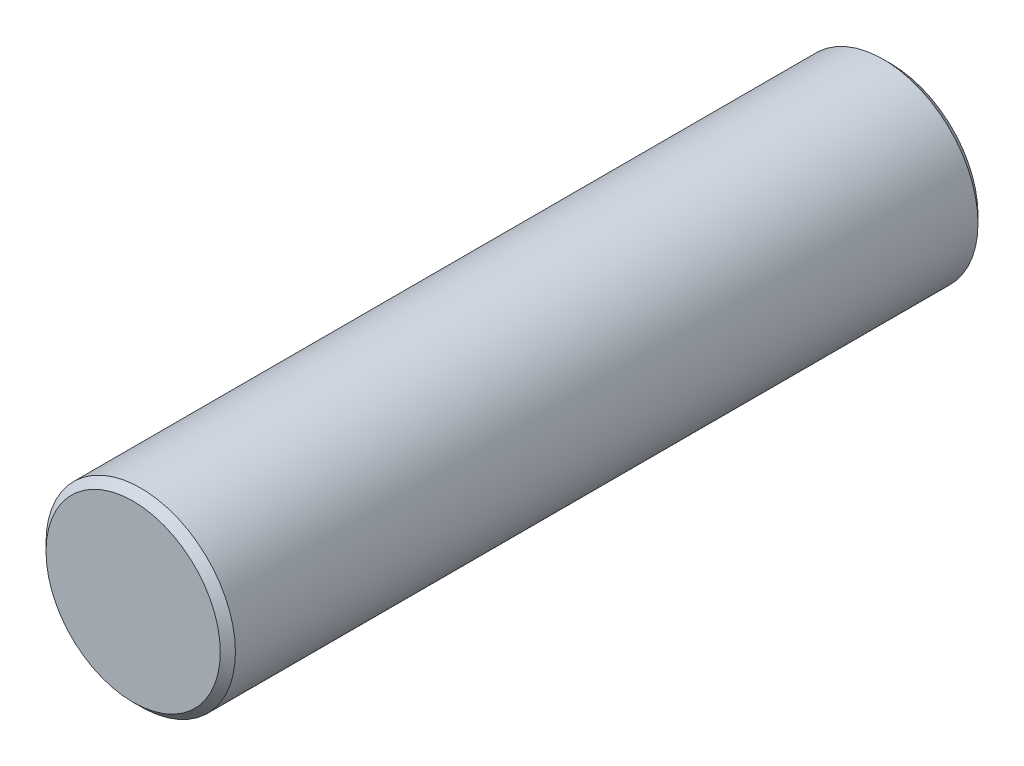
ISO-10303-21;
HEADER;
FILE_DESCRIPTION(('STEP AP214'),'2;1');
FILE_NAME('part.step','',(''),(''),'','','');
FILE_SCHEMA(('AUTOMOTIVE_DESIGN { 1 0 10303 214 1 1 1 1 }'));
ENDSEC;
DATA;
#1=APPLICATION_CONTEXT('core data for automotive mechanical design processes');
#2=APPLICATION_PROTOCOL_DEFINITION('international standard','automotive_design',2000,#1);
#3=PRODUCT_CONTEXT('',#1,'mechanical');
#4=PRODUCT('Part','Part','',(#3));
#5=PRODUCT_RELATED_PRODUCT_CATEGORY('part','',(#4));
#6=PRODUCT_DEFINITION_FORMATION('','',#4);
#7=PRODUCT_DEFINITION_CONTEXT('part definition',#1,'design');
#8=PRODUCT_DEFINITION('design','',#6,#7);
#9=PRODUCT_DEFINITION_SHAPE('','',#8);
#10=(LENGTH_UNIT() NAMED_UNIT(*) SI_UNIT(.MILLI.,.METRE.));
#11=(NAMED_UNIT(*) PLANE_ANGLE_UNIT() SI_UNIT($,.RADIAN.));
#12=(NAMED_UNIT(*) SI_UNIT($,.STERADIAN.) SOLID_ANGLE_UNIT());
#13=UNCERTAINTY_MEASURE_WITH_UNIT(LENGTH_MEASURE(1.E-05),#10,'distance_accuracy_value','');
#14=(GEOMETRIC_REPRESENTATION_CONTEXT(3) GLOBAL_UNCERTAINTY_ASSIGNED_CONTEXT((#13)) GLOBAL_UNIT_ASSIGNED_CONTEXT((#10,
#11,#12)) REPRESENTATION_CONTEXT('',''));
#15=CARTESIAN_POINT('',(0.,0.,0.));
#16=DIRECTION('',(0.,0.,1.));
#17=DIRECTION('',(1.,0.,0.));
#18=AXIS2_PLACEMENT_3D('',#15,#16,#17);
#19=CARTESIAN_POINT('',(0.,0.,25.4));
#20=DIRECTION('',(0.,0.,-1.));
#21=DIRECTION('',(-1.,0.,0.));
#22=AXIS2_PLACEMENT_3D('',#19,#20,#21);
#23=CYLINDRICAL_SURFACE('',#22,3.175);
#24=CARTESIAN_POINT('',(0.,0.,0.253999999999997));
#25=DIRECTION('',(0.,0.,1.));
#26=DIRECTION('',(1.,0.,0.));
#27=AXIS2_PLACEMENT_3D('',#24,#25,#26);
#28=CIRCLE('',#27,3.175);
#29=CARTESIAN_POINT('',(3.175,0.,0.253999999999997));
#30=VERTEX_POINT('',#29);
#31=EDGE_CURVE('E51',#30,#30,#28,.T.);
#32=ORIENTED_EDGE('',*,*,#31,.T.);
#33=EDGE_LOOP('',(#32));
#34=FACE_BOUND('',#33,.T.);
#35=CARTESIAN_POINT('',(0.,0.,25.146));
#36=DIRECTION('',(0.,0.,1.));
#37=DIRECTION('',(1.,0.,0.));
#38=AXIS2_PLACEMENT_3D('',#35,#36,#37);
#39=CIRCLE('',#38,3.175);
#40=CARTESIAN_POINT('',(3.175,0.,25.146));
#41=VERTEX_POINT('',#40);
#42=EDGE_CURVE('E54',#41,#41,#39,.F.);
#43=ORIENTED_EDGE('',*,*,#42,.T.);
#44=EDGE_LOOP('',(#43));
#45=FACE_BOUND('',#44,.T.);
#46=ADVANCED_FACE('F39',(#34,#45),#23,.T.);
#47=CARTESIAN_POINT('',(0.,0.,25.4));
#48=DIRECTION('',(0.,0.,1.));
#49=DIRECTION('',(1.,0.,0.));
#50=AXIS2_PLACEMENT_3D('',#47,#48,#49);
#51=PLANE('',#50);
#52=CARTESIAN_POINT('',(0.,0.,25.4));
#53=DIRECTION('',(0.,0.,1.));
#54=DIRECTION('',(1.,0.,0.));
#55=AXIS2_PLACEMENT_3D('',#52,#53,#54);
#56=CIRCLE('',#55,2.921);
#57=CARTESIAN_POINT('',(2.921,0.,25.4));
#58=VERTEX_POINT('',#57);
#59=EDGE_CURVE('E10',#58,#58,#56,.T.);
#60=ORIENTED_EDGE('',*,*,#59,.T.);
#61=EDGE_LOOP('',(#60));
#62=FACE_BOUND('',#61,.T.);
#63=ADVANCED_FACE('F72',(#62),#51,.T.);
#64=CARTESIAN_POINT('',(0.,0.,0.));
#65=DIRECTION('',(0.,0.,1.));
#66=DIRECTION('',(1.,0.,0.));
#67=AXIS2_PLACEMENT_3D('',#64,#65,#66);
#68=PLANE('',#67);
#69=CARTESIAN_POINT('',(0.,0.,0.));
#70=DIRECTION('',(0.,0.,1.));
#71=DIRECTION('',(1.,0.,0.));
#72=AXIS2_PLACEMENT_3D('',#69,#70,#71);
#73=CIRCLE('',#72,2.921);
#74=CARTESIAN_POINT('',(2.921,0.,0.));
#75=VERTEX_POINT('',#74);
#76=EDGE_CURVE('E50',#75,#75,#73,.F.);
#77=ORIENTED_EDGE('',*,*,#76,.T.);
#78=EDGE_LOOP('',(#77));
#79=FACE_BOUND('',#78,.T.);
#80=ADVANCED_FACE('F67',(#79),#68,.F.);
#81=CARTESIAN_POINT('',(0.,0.,0.253999999999997));
#82=DIRECTION('',(0.,0.,1.));
#83=DIRECTION('',(1.,0.,0.));
#84=AXIS2_PLACEMENT_3D('',#81,#82,#83);
#85=CONICAL_SURFACE('',#84,3.175,0.785398163397446);
#86=ORIENTED_EDGE('',*,*,#76,.F.);
#87=EDGE_LOOP('',(#86));
#88=FACE_BOUND('',#87,.T.);
#89=ORIENTED_EDGE('',*,*,#31,.F.);
#90=EDGE_LOOP('',(#89));
#91=FACE_BOUND('',#90,.T.);
#92=ADVANCED_FACE('F61',(#88,#91),#85,.T.);
#93=CARTESIAN_POINT('',(0.,0.,25.4));
#94=DIRECTION('',(0.,0.,-1.));
#95=DIRECTION('',(-1.,0.,0.));
#96=AXIS2_PLACEMENT_3D('',#93,#94,#95);
#97=CONICAL_SURFACE('',#96,2.921,0.785398163397447);
#98=ORIENTED_EDGE('',*,*,#42,.F.);
#99=EDGE_LOOP('',(#98));
#100=FACE_BOUND('',#99,.T.);
#101=ORIENTED_EDGE('',*,*,#59,.F.);
#102=EDGE_LOOP('',(#101));
#103=FACE_BOUND('',#102,.T.);
#104=ADVANCED_FACE('F45',(#100,#103),#97,.T.);
#105=CLOSED_SHELL('',(#46,#63,#80,#92,#104));
#106=MANIFOLD_SOLID_BREP('B2',#105);
#107=ADVANCED_BREP_SHAPE_REPRESENTATION('',(#18,#106),#14);
#108=SHAPE_DEFINITION_REPRESENTATION(#9,#107);
ENDSEC;
END-ISO-10303-21;
